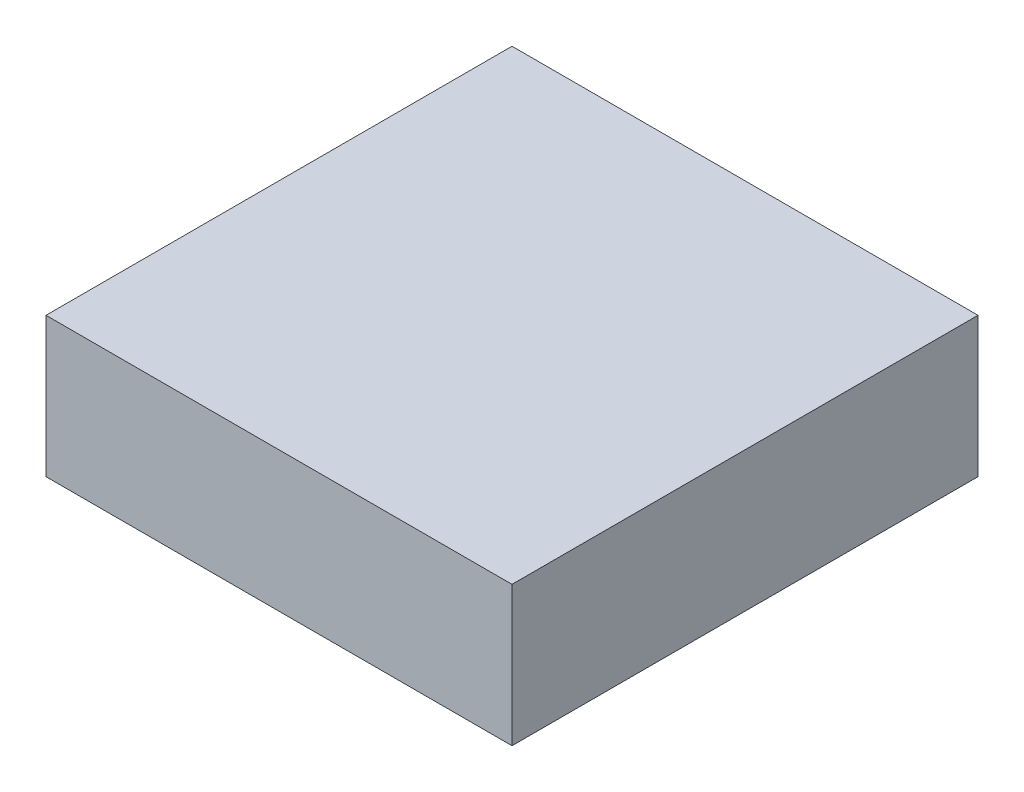
ISO-10303-21;
HEADER;
FILE_DESCRIPTION(('STEP AP214'),'2;1');
FILE_NAME('part.step','',(''),(''),'','','');
FILE_SCHEMA(('AUTOMOTIVE_DESIGN { 1 0 10303 214 1 1 1 1 }'));
ENDSEC;
DATA;
#1=APPLICATION_CONTEXT('core data for automotive mechanical design processes');
#2=APPLICATION_PROTOCOL_DEFINITION('international standard','automotive_design',2000,#1);
#3=PRODUCT_CONTEXT('',#1,'mechanical');
#4=PRODUCT('Part','Part','',(#3));
#5=PRODUCT_RELATED_PRODUCT_CATEGORY('part','',(#4));
#6=PRODUCT_DEFINITION_FORMATION('','',#4);
#7=PRODUCT_DEFINITION_CONTEXT('part definition',#1,'design');
#8=PRODUCT_DEFINITION('design','',#6,#7);
#9=PRODUCT_DEFINITION_SHAPE('','',#8);
#10=(LENGTH_UNIT() NAMED_UNIT(*) SI_UNIT(.MILLI.,.METRE.));
#11=(NAMED_UNIT(*) PLANE_ANGLE_UNIT() SI_UNIT($,.RADIAN.));
#12=(NAMED_UNIT(*) SI_UNIT($,.STERADIAN.) SOLID_ANGLE_UNIT());
#13=UNCERTAINTY_MEASURE_WITH_UNIT(LENGTH_MEASURE(1.E-05),#10,'distance_accuracy_value','');
#14=(GEOMETRIC_REPRESENTATION_CONTEXT(3) GLOBAL_UNCERTAINTY_ASSIGNED_CONTEXT((#13)) GLOBAL_UNIT_ASSIGNED_CONTEXT((#10,
#11,#12)) REPRESENTATION_CONTEXT('',''));
#15=CARTESIAN_POINT('',(0.,0.,0.));
#16=DIRECTION('',(0.,0.,1.));
#17=DIRECTION('',(1.,0.,0.));
#18=AXIS2_PLACEMENT_3D('',#15,#16,#17);
#19=CARTESIAN_POINT('',(0.,150.,0.));
#20=DIRECTION('',(1.,0.,0.));
#21=DIRECTION('',(0.,0.,-1.));
#22=AXIS2_PLACEMENT_3D('',#19,#20,#21);
#23=PLANE('',#22);
#24=DIRECTION('',(0.,0.,1.));
#25=VECTOR('',#24,1.);
#26=CARTESIAN_POINT('',(0.,0.,0.));
#27=LINE('',#26,#25);
#28=CARTESIAN_POINT('',(0.,0.,-500.));
#29=VERTEX_POINT('',#28);
#30=CARTESIAN_POINT('',(0.,0.,0.));
#31=VERTEX_POINT('',#30);
#32=EDGE_CURVE('E106',#29,#31,#27,.T.);
#33=ORIENTED_EDGE('',*,*,#32,.T.);
#34=DIRECTION('',(0.,-1.,0.));
#35=VECTOR('',#34,1.);
#36=CARTESIAN_POINT('',(0.,150.,0.));
#37=LINE('',#36,#35);
#38=CARTESIAN_POINT('',(0.,150.,0.));
#39=VERTEX_POINT('',#38);
#40=EDGE_CURVE('E11',#39,#31,#37,.T.);
#41=ORIENTED_EDGE('',*,*,#40,.F.);
#42=DIRECTION('',(0.,0.,1.));
#43=VECTOR('',#42,1.);
#44=CARTESIAN_POINT('',(0.,150.,0.));
#45=LINE('',#44,#43);
#46=CARTESIAN_POINT('',(0.,150.,-500.));
#47=VERTEX_POINT('',#46);
#48=EDGE_CURVE('E94',#47,#39,#45,.T.);
#49=ORIENTED_EDGE('',*,*,#48,.F.);
#50=DIRECTION('',(0.,-1.,0.));
#51=VECTOR('',#50,1.);
#52=CARTESIAN_POINT('',(0.,150.,-500.));
#53=LINE('',#52,#51);
#54=EDGE_CURVE('E102',#47,#29,#53,.T.);
#55=ORIENTED_EDGE('',*,*,#54,.T.);
#56=EDGE_LOOP('',(#33,#41,#49,#55));
#57=FACE_BOUND('',#56,.T.);
#58=ADVANCED_FACE('F43',(#57),#23,.F.);
#59=CARTESIAN_POINT('',(0.,150.,0.));
#60=DIRECTION('',(0.,0.,-1.));
#61=DIRECTION('',(-1.,0.,0.));
#62=AXIS2_PLACEMENT_3D('',#59,#60,#61);
#63=PLANE('',#62);
#64=DIRECTION('',(1.,0.,0.));
#65=VECTOR('',#64,1.);
#66=CARTESIAN_POINT('',(0.,0.,0.));
#67=LINE('',#66,#65);
#68=CARTESIAN_POINT('',(500.,0.,0.));
#69=VERTEX_POINT('',#68);
#70=EDGE_CURVE('E98',#31,#69,#67,.T.);
#71=ORIENTED_EDGE('',*,*,#70,.T.);
#72=DIRECTION('',(0.,-1.,0.));
#73=VECTOR('',#72,1.);
#74=CARTESIAN_POINT('',(500.,150.,0.));
#75=LINE('',#74,#73);
#76=CARTESIAN_POINT('',(500.,150.,0.));
#77=VERTEX_POINT('',#76);
#78=EDGE_CURVE('E51',#77,#69,#75,.T.);
#79=ORIENTED_EDGE('',*,*,#78,.F.);
#80=DIRECTION('',(1.,0.,0.));
#81=VECTOR('',#80,1.);
#82=CARTESIAN_POINT('',(0.,150.,0.));
#83=LINE('',#82,#81);
#84=EDGE_CURVE('E89',#39,#77,#83,.T.);
#85=ORIENTED_EDGE('',*,*,#84,.F.);
#86=ORIENTED_EDGE('',*,*,#40,.T.);
#87=EDGE_LOOP('',(#71,#79,#85,#86));
#88=FACE_BOUND('',#87,.T.);
#89=ADVANCED_FACE('F97',(#88),#63,.F.);
#90=CARTESIAN_POINT('',(500.,150.,0.));
#91=DIRECTION('',(-1.,0.,0.));
#92=DIRECTION('',(0.,0.,1.));
#93=AXIS2_PLACEMENT_3D('',#90,#91,#92);
#94=PLANE('',#93);
#95=DIRECTION('',(0.,0.,-1.));
#96=VECTOR('',#95,1.);
#97=CARTESIAN_POINT('',(500.,0.,0.));
#98=LINE('',#97,#96);
#99=CARTESIAN_POINT('',(500.,0.,-500.));
#100=VERTEX_POINT('',#99);
#101=EDGE_CURVE('E76',#69,#100,#98,.T.);
#102=ORIENTED_EDGE('',*,*,#101,.T.);
#103=DIRECTION('',(0.,-1.,0.));
#104=VECTOR('',#103,1.);
#105=CARTESIAN_POINT('',(500.,150.,-500.));
#106=LINE('',#105,#104);
#107=CARTESIAN_POINT('',(500.,150.,-500.));
#108=VERTEX_POINT('',#107);
#109=EDGE_CURVE('E99',#108,#100,#106,.T.);
#110=ORIENTED_EDGE('',*,*,#109,.F.);
#111=DIRECTION('',(0.,0.,-1.));
#112=VECTOR('',#111,1.);
#113=CARTESIAN_POINT('',(500.,150.,0.));
#114=LINE('',#113,#112);
#115=EDGE_CURVE('E92',#77,#108,#114,.T.);
#116=ORIENTED_EDGE('',*,*,#115,.F.);
#117=ORIENTED_EDGE('',*,*,#78,.T.);
#118=EDGE_LOOP('',(#102,#110,#116,#117));
#119=FACE_BOUND('',#118,.T.);
#120=ADVANCED_FACE('F100',(#119),#94,.F.);
#121=CARTESIAN_POINT('',(0.,150.,-500.));
#122=DIRECTION('',(0.,0.,1.));
#123=DIRECTION('',(1.,0.,0.));
#124=AXIS2_PLACEMENT_3D('',#121,#122,#123);
#125=PLANE('',#124);
#126=DIRECTION('',(-1.,0.,0.));
#127=VECTOR('',#126,1.);
#128=CARTESIAN_POINT('',(0.,0.,-500.));
#129=LINE('',#128,#127);
#130=EDGE_CURVE('E82',#100,#29,#129,.T.);
#131=ORIENTED_EDGE('',*,*,#130,.T.);
#132=ORIENTED_EDGE('',*,*,#54,.F.);
#133=DIRECTION('',(-1.,0.,0.));
#134=VECTOR('',#133,1.);
#135=CARTESIAN_POINT('',(0.,150.,-500.));
#136=LINE('',#135,#134);
#137=EDGE_CURVE('E59',#108,#47,#136,.T.);
#138=ORIENTED_EDGE('',*,*,#137,.F.);
#139=ORIENTED_EDGE('',*,*,#109,.T.);
#140=EDGE_LOOP('',(#131,#132,#138,#139));
#141=FACE_BOUND('',#140,.T.);
#142=ADVANCED_FACE('F113',(#141),#125,.F.);
#143=CARTESIAN_POINT('',(0.,150.,0.));
#144=DIRECTION('',(0.,-1.,0.));
#145=DIRECTION('',(0.,0.,-1.));
#146=AXIS2_PLACEMENT_3D('',#143,#144,#145);
#147=PLANE('',#146);
#148=ORIENTED_EDGE('',*,*,#48,.T.);
#149=ORIENTED_EDGE('',*,*,#84,.T.);
#150=ORIENTED_EDGE('',*,*,#115,.T.);
#151=ORIENTED_EDGE('',*,*,#137,.T.);
#152=EDGE_LOOP('',(#148,#149,#150,#151));
#153=FACE_BOUND('',#152,.T.);
#154=ADVANCED_FACE('F90',(#153),#147,.F.);
#155=CARTESIAN_POINT('',(0.,0.,0.));
#156=DIRECTION('',(0.,-1.,0.));
#157=DIRECTION('',(0.,0.,-1.));
#158=AXIS2_PLACEMENT_3D('',#155,#156,#157);
#159=PLANE('',#158);
#160=ORIENTED_EDGE('',*,*,#32,.F.);
#161=ORIENTED_EDGE('',*,*,#130,.F.);
#162=ORIENTED_EDGE('',*,*,#101,.F.);
#163=ORIENTED_EDGE('',*,*,#70,.F.);
#164=EDGE_LOOP('',(#160,#161,#162,#163));
#165=FACE_BOUND('',#164,.T.);
#166=ADVANCED_FACE('F116',(#165),#159,.T.);
#167=CLOSED_SHELL('',(#58,#89,#120,#142,#154,#166));
#168=MANIFOLD_SOLID_BREP('B2',#167);
#169=ADVANCED_BREP_SHAPE_REPRESENTATION('',(#18,#168),#14);
#170=SHAPE_DEFINITION_REPRESENTATION(#9,#169);
ENDSEC;
END-ISO-10303-21;
